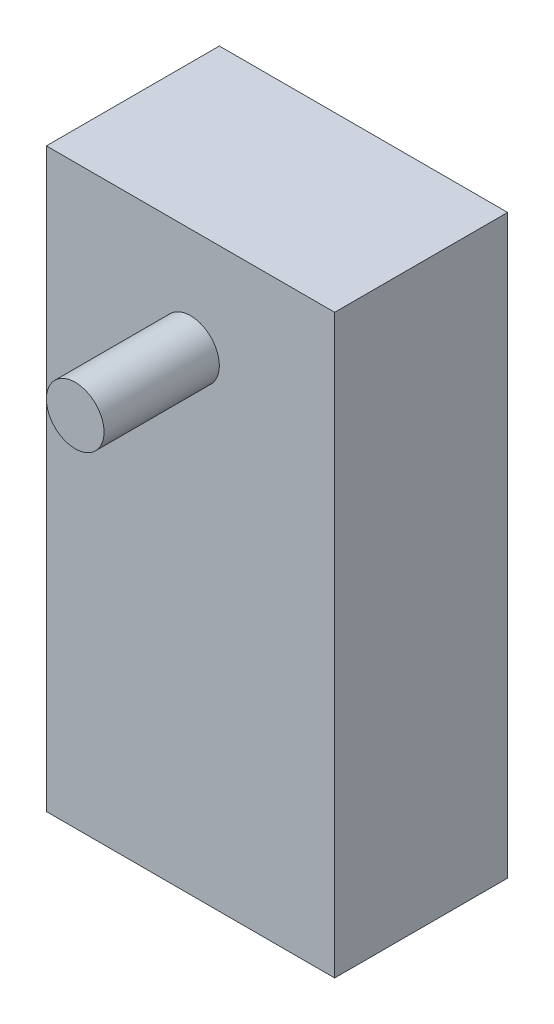
ISO-10303-21;
HEADER;
FILE_DESCRIPTION(('STEP AP214'),'2;1');
FILE_NAME('part.step','',(''),(''),'','','');
FILE_SCHEMA(('AUTOMOTIVE_DESIGN { 1 0 10303 214 1 1 1 1 }'));
ENDSEC;
DATA;
#1=APPLICATION_CONTEXT('core data for automotive mechanical design processes');
#2=APPLICATION_PROTOCOL_DEFINITION('international standard','automotive_design',2000,#1);
#3=PRODUCT_CONTEXT('',#1,'mechanical');
#4=PRODUCT('Part','Part','',(#3));
#5=PRODUCT_RELATED_PRODUCT_CATEGORY('part','',(#4));
#6=PRODUCT_DEFINITION_FORMATION('','',#4);
#7=PRODUCT_DEFINITION_CONTEXT('part definition',#1,'design');
#8=PRODUCT_DEFINITION('design','',#6,#7);
#9=PRODUCT_DEFINITION_SHAPE('','',#8);
#10=(LENGTH_UNIT() NAMED_UNIT(*) SI_UNIT(.MILLI.,.METRE.));
#11=(NAMED_UNIT(*) PLANE_ANGLE_UNIT() SI_UNIT($,.RADIAN.));
#12=(NAMED_UNIT(*) SI_UNIT($,.STERADIAN.) SOLID_ANGLE_UNIT());
#13=UNCERTAINTY_MEASURE_WITH_UNIT(LENGTH_MEASURE(1.E-05),#10,'distance_accuracy_value','');
#14=(GEOMETRIC_REPRESENTATION_CONTEXT(3) GLOBAL_UNCERTAINTY_ASSIGNED_CONTEXT((#13)) GLOBAL_UNIT_ASSIGNED_CONTEXT((#10,
#11,#12)) REPRESENTATION_CONTEXT('',''));
#15=CARTESIAN_POINT('',(0.,0.,0.));
#16=DIRECTION('',(0.,0.,1.));
#17=DIRECTION('',(1.,0.,0.));
#18=AXIS2_PLACEMENT_3D('',#15,#16,#17);
#19=CARTESIAN_POINT('',(-15.875,-31.75,19.05));
#20=DIRECTION('',(1.,0.,0.));
#21=DIRECTION('',(0.,0.,-1.));
#22=AXIS2_PLACEMENT_3D('',#19,#20,#21);
#23=PLANE('',#22);
#24=DIRECTION('',(0.,-1.,0.));
#25=VECTOR('',#24,1.);
#26=CARTESIAN_POINT('',(-15.875,-31.75,0.));
#27=LINE('',#26,#25);
#28=CARTESIAN_POINT('',(-15.875,31.75,0.));
#29=VERTEX_POINT('',#28);
#30=CARTESIAN_POINT('',(-15.875,-31.75,0.));
#31=VERTEX_POINT('',#30);
#32=EDGE_CURVE('E113',#29,#31,#27,.T.);
#33=ORIENTED_EDGE('',*,*,#32,.T.);
#34=DIRECTION('',(0.,0.,-1.));
#35=VECTOR('',#34,1.);
#36=CARTESIAN_POINT('',(-15.875,-31.75,19.05));
#37=LINE('',#36,#35);
#38=CARTESIAN_POINT('',(-15.875,-31.75,19.05));
#39=VERTEX_POINT('',#38);
#40=EDGE_CURVE('E11',#39,#31,#37,.T.);
#41=ORIENTED_EDGE('',*,*,#40,.F.);
#42=DIRECTION('',(0.,-1.,0.));
#43=VECTOR('',#42,1.);
#44=CARTESIAN_POINT('',(-15.875,-31.75,19.05));
#45=LINE('',#44,#43);
#46=CARTESIAN_POINT('',(-15.875,31.75,19.05));
#47=VERTEX_POINT('',#46);
#48=EDGE_CURVE('E97',#47,#39,#45,.T.);
#49=ORIENTED_EDGE('',*,*,#48,.F.);
#50=DIRECTION('',(0.,0.,-1.));
#51=VECTOR('',#50,1.);
#52=CARTESIAN_POINT('',(-15.875,31.75,19.05));
#53=LINE('',#52,#51);
#54=EDGE_CURVE('E109',#47,#29,#53,.T.);
#55=ORIENTED_EDGE('',*,*,#54,.T.);
#56=EDGE_LOOP('',(#33,#41,#49,#55));
#57=FACE_BOUND('',#56,.T.);
#58=ADVANCED_FACE('F45',(#57),#23,.F.);
#59=CARTESIAN_POINT('',(15.875,-31.75,19.05));
#60=DIRECTION('',(0.,1.,0.));
#61=DIRECTION('',(0.,0.,1.));
#62=AXIS2_PLACEMENT_3D('',#59,#60,#61);
#63=PLANE('',#62);
#64=DIRECTION('',(1.,0.,0.));
#65=VECTOR('',#64,1.);
#66=CARTESIAN_POINT('',(15.875,-31.75,0.));
#67=LINE('',#66,#65);
#68=CARTESIAN_POINT('',(15.875,-31.75,0.));
#69=VERTEX_POINT('',#68);
#70=EDGE_CURVE('E102',#31,#69,#67,.T.);
#71=ORIENTED_EDGE('',*,*,#70,.T.);
#72=DIRECTION('',(0.,0.,-1.));
#73=VECTOR('',#72,1.);
#74=CARTESIAN_POINT('',(15.875,-31.75,19.05));
#75=LINE('',#74,#73);
#76=CARTESIAN_POINT('',(15.875,-31.75,19.05));
#77=VERTEX_POINT('',#76);
#78=EDGE_CURVE('E54',#77,#69,#75,.T.);
#79=ORIENTED_EDGE('',*,*,#78,.F.);
#80=DIRECTION('',(1.,0.,0.));
#81=VECTOR('',#80,1.);
#82=CARTESIAN_POINT('',(15.875,-31.75,19.05));
#83=LINE('',#82,#81);
#84=EDGE_CURVE('E92',#39,#77,#83,.T.);
#85=ORIENTED_EDGE('',*,*,#84,.F.);
#86=ORIENTED_EDGE('',*,*,#40,.T.);
#87=EDGE_LOOP('',(#71,#79,#85,#86));
#88=FACE_BOUND('',#87,.T.);
#89=ADVANCED_FACE('F101',(#88),#63,.F.);
#90=CARTESIAN_POINT('',(15.875,-31.75,19.05));
#91=DIRECTION('',(-1.,0.,0.));
#92=DIRECTION('',(0.,0.,1.));
#93=AXIS2_PLACEMENT_3D('',#90,#91,#92);
#94=PLANE('',#93);
#95=DIRECTION('',(0.,1.,0.));
#96=VECTOR('',#95,1.);
#97=CARTESIAN_POINT('',(15.875,-31.75,0.));
#98=LINE('',#97,#96);
#99=CARTESIAN_POINT('',(15.875,31.75,0.));
#100=VERTEX_POINT('',#99);
#101=EDGE_CURVE('E79',#69,#100,#98,.T.);
#102=ORIENTED_EDGE('',*,*,#101,.T.);
#103=DIRECTION('',(0.,0.,-1.));
#104=VECTOR('',#103,1.);
#105=CARTESIAN_POINT('',(15.875,31.75,19.05));
#106=LINE('',#105,#104);
#107=CARTESIAN_POINT('',(15.875,31.75,19.05));
#108=VERTEX_POINT('',#107);
#109=EDGE_CURVE('E104',#108,#100,#106,.T.);
#110=ORIENTED_EDGE('',*,*,#109,.F.);
#111=DIRECTION('',(0.,1.,0.));
#112=VECTOR('',#111,1.);
#113=CARTESIAN_POINT('',(15.875,-31.75,19.05));
#114=LINE('',#113,#112);
#115=EDGE_CURVE('E95',#77,#108,#114,.T.);
#116=ORIENTED_EDGE('',*,*,#115,.F.);
#117=ORIENTED_EDGE('',*,*,#78,.T.);
#118=EDGE_LOOP('',(#102,#110,#116,#117));
#119=FACE_BOUND('',#118,.T.);
#120=ADVANCED_FACE('F105',(#119),#94,.F.);
#121=CARTESIAN_POINT('',(15.875,31.75,19.05));
#122=DIRECTION('',(0.,-1.,0.));
#123=DIRECTION('',(1.,0.,0.));
#124=AXIS2_PLACEMENT_3D('',#121,#122,#123);
#125=PLANE('',#124);
#126=DIRECTION('',(-1.,0.,0.));
#127=VECTOR('',#126,1.);
#128=CARTESIAN_POINT('',(15.875,31.75,0.));
#129=LINE('',#128,#127);
#130=EDGE_CURVE('E85',#100,#29,#129,.T.);
#131=ORIENTED_EDGE('',*,*,#130,.T.);
#132=ORIENTED_EDGE('',*,*,#54,.F.);
#133=DIRECTION('',(-1.,0.,0.));
#134=VECTOR('',#133,1.);
#135=CARTESIAN_POINT('',(15.875,31.75,19.05));
#136=LINE('',#135,#134);
#137=EDGE_CURVE('E62',#108,#47,#136,.T.);
#138=ORIENTED_EDGE('',*,*,#137,.F.);
#139=ORIENTED_EDGE('',*,*,#109,.T.);
#140=EDGE_LOOP('',(#131,#132,#138,#139));
#141=FACE_BOUND('',#140,.T.);
#142=ADVANCED_FACE('F127',(#141),#125,.F.);
#143=CARTESIAN_POINT('',(0.,0.,19.05));
#144=DIRECTION('',(0.,0.,1.));
#145=DIRECTION('',(1.,0.,0.));
#146=AXIS2_PLACEMENT_3D('',#143,#144,#145);
#147=PLANE('',#146);
#148=CARTESIAN_POINT('',(0.,20.315619897,19.05));
#149=DIRECTION('',(0.,0.,1.));
#150=DIRECTION('',(1.,0.,0.));
#151=AXIS2_PLACEMENT_3D('',#148,#149,#150);
#152=CIRCLE('',#151,3.175);
#153=CARTESIAN_POINT('',(3.17500000000001,20.315619897,19.05));
#154=VERTEX_POINT('',#153);
#155=EDGE_CURVE('E134',#154,#154,#152,.T.);
#156=ORIENTED_EDGE('',*,*,#155,.F.);
#157=EDGE_LOOP('',(#156));
#158=FACE_BOUND('',#157,.T.);
#159=ORIENTED_EDGE('',*,*,#48,.T.);
#160=ORIENTED_EDGE('',*,*,#84,.T.);
#161=ORIENTED_EDGE('',*,*,#115,.T.);
#162=ORIENTED_EDGE('',*,*,#137,.T.);
#163=EDGE_LOOP('',(#159,#160,#161,#162));
#164=FACE_BOUND('',#163,.T.);
#165=ADVANCED_FACE('F93',(#158,#164),#147,.T.);
#166=CARTESIAN_POINT('',(0.,0.,0.));
#167=DIRECTION('',(0.,0.,1.));
#168=DIRECTION('',(1.,0.,0.));
#169=AXIS2_PLACEMENT_3D('',#166,#167,#168);
#170=PLANE('',#169);
#171=ORIENTED_EDGE('',*,*,#32,.F.);
#172=ORIENTED_EDGE('',*,*,#130,.F.);
#173=ORIENTED_EDGE('',*,*,#101,.F.);
#174=ORIENTED_EDGE('',*,*,#70,.F.);
#175=EDGE_LOOP('',(#171,#172,#173,#174));
#176=FACE_BOUND('',#175,.T.);
#177=ADVANCED_FACE('F130',(#176),#170,.F.);
#178=CARTESIAN_POINT('',(0.,20.315619897,31.75));
#179=DIRECTION('',(0.,0.,-1.));
#180=DIRECTION('',(-1.,0.,0.));
#181=AXIS2_PLACEMENT_3D('',#178,#179,#180);
#182=CYLINDRICAL_SURFACE('',#181,3.175);
#183=CARTESIAN_POINT('',(0.,20.315619897,31.75));
#184=DIRECTION('',(0.,0.,1.));
#185=DIRECTION('',(1.,0.,0.));
#186=AXIS2_PLACEMENT_3D('',#183,#184,#185);
#187=CIRCLE('',#186,3.175);
#188=CARTESIAN_POINT('',(3.17500000000001,20.315619897,31.75));
#189=VERTEX_POINT('',#188);
#190=EDGE_CURVE('E117',#189,#189,#187,.T.);
#191=ORIENTED_EDGE('',*,*,#190,.F.);
#192=EDGE_LOOP('',(#191));
#193=FACE_BOUND('',#192,.T.);
#194=ORIENTED_EDGE('',*,*,#155,.T.);
#195=EDGE_LOOP('',(#194));
#196=FACE_BOUND('',#195,.T.);
#197=ADVANCED_FACE('F144',(#193,#196),#182,.T.);
#198=CARTESIAN_POINT('',(0.,20.315619897,31.75));
#199=DIRECTION('',(0.,0.,1.));
#200=DIRECTION('',(1.,0.,0.));
#201=AXIS2_PLACEMENT_3D('',#198,#199,#200);
#202=PLANE('',#201);
#203=ORIENTED_EDGE('',*,*,#190,.T.);
#204=EDGE_LOOP('',(#203));
#205=FACE_BOUND('',#204,.T.);
#206=ADVANCED_FACE('F142',(#205),#202,.T.);
#207=CLOSED_SHELL('',(#58,#89,#120,#142,#165,#177,#197,#206));
#208=MANIFOLD_SOLID_BREP('B2',#207);
#209=ADVANCED_BREP_SHAPE_REPRESENTATION('',(#18,#208),#14);
#210=SHAPE_DEFINITION_REPRESENTATION(#9,#209);
ENDSEC;
END-ISO-10303-21;
